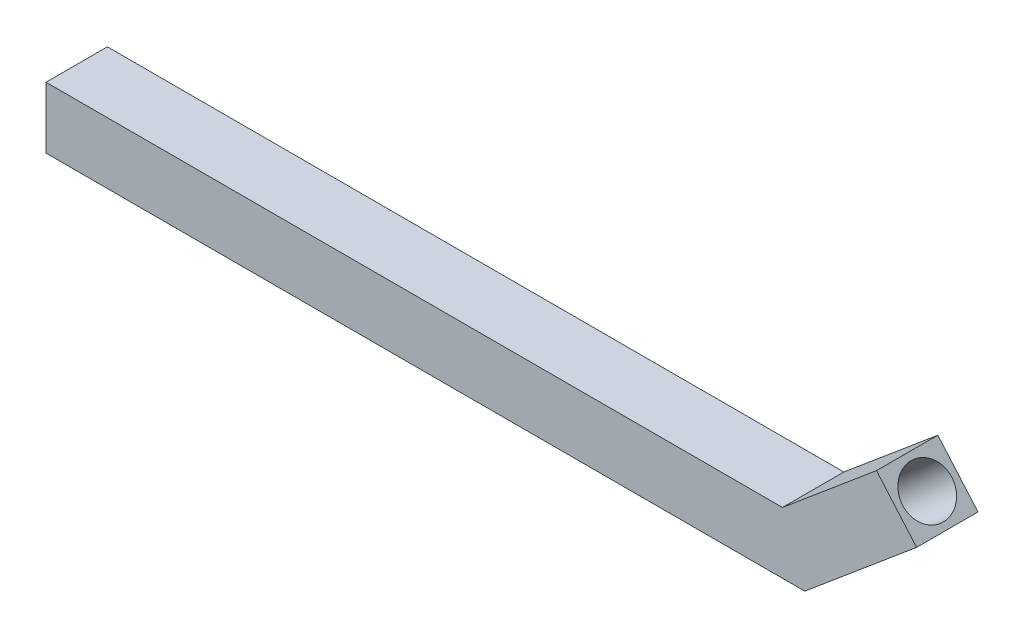
ISO-10303-21;
HEADER;
FILE_DESCRIPTION(('STEP AP214'),'2;1');
FILE_NAME('part.step','',(''),(''),'','','');
FILE_SCHEMA(('AUTOMOTIVE_DESIGN { 1 0 10303 214 1 1 1 1 }'));
ENDSEC;
DATA;
#1=APPLICATION_CONTEXT('core data for automotive mechanical design processes');
#2=APPLICATION_PROTOCOL_DEFINITION('international standard','automotive_design',2000,#1);
#3=PRODUCT_CONTEXT('',#1,'mechanical');
#4=PRODUCT('Part','Part','',(#3));
#5=PRODUCT_RELATED_PRODUCT_CATEGORY('part','',(#4));
#6=PRODUCT_DEFINITION_FORMATION('','',#4);
#7=PRODUCT_DEFINITION_CONTEXT('part definition',#1,'design');
#8=PRODUCT_DEFINITION('design','',#6,#7);
#9=PRODUCT_DEFINITION_SHAPE('','',#8);
#10=(LENGTH_UNIT() NAMED_UNIT(*) SI_UNIT(.MILLI.,.METRE.));
#11=(NAMED_UNIT(*) PLANE_ANGLE_UNIT() SI_UNIT($,.RADIAN.));
#12=(NAMED_UNIT(*) SI_UNIT($,.STERADIAN.) SOLID_ANGLE_UNIT());
#13=UNCERTAINTY_MEASURE_WITH_UNIT(LENGTH_MEASURE(1.E-05),#10,'distance_accuracy_value','');
#14=(GEOMETRIC_REPRESENTATION_CONTEXT(3) GLOBAL_UNCERTAINTY_ASSIGNED_CONTEXT((#13)) GLOBAL_UNIT_ASSIGNED_CONTEXT((#10,
#11,#12)) REPRESENTATION_CONTEXT('',''));
#15=CARTESIAN_POINT('',(0.,0.,0.));
#16=DIRECTION('',(0.,0.,1.));
#17=DIRECTION('',(1.,0.,0.));
#18=AXIS2_PLACEMENT_3D('',#15,#16,#17);
#19=CARTESIAN_POINT('',(-5.,-2.5,2.5));
#20=DIRECTION('',(0.,1.,0.));
#21=DIRECTION('',(0.,0.,1.));
#22=AXIS2_PLACEMENT_3D('',#19,#20,#21);
#23=PLANE('',#22);
#24=DIRECTION('',(1.,0.,0.));
#25=VECTOR('',#24,1.);
#26=CARTESIAN_POINT('',(-5.,-2.5,0.));
#27=LINE('',#26,#25);
#28=CARTESIAN_POINT('',(-30.,-2.5,0.));
#29=VERTEX_POINT('',#28);
#30=CARTESIAN_POINT('',(0.909480398793596,-2.5,0.));
#31=VERTEX_POINT('',#30);
#32=EDGE_CURVE('E127',#29,#31,#27,.T.);
#33=ORIENTED_EDGE('',*,*,#32,.T.);
#34=DIRECTION('',(0.,0.,-1.));
#35=VECTOR('',#34,1.);
#36=CARTESIAN_POINT('',(0.909480398793596,-2.5,2.5));
#37=LINE('',#36,#35);
#38=CARTESIAN_POINT('',(0.909480398793596,-2.5,2.5));
#39=VERTEX_POINT('',#38);
#40=EDGE_CURVE('E11',#39,#31,#37,.T.);
#41=ORIENTED_EDGE('',*,*,#40,.F.);
#42=DIRECTION('',(1.,0.,0.));
#43=VECTOR('',#42,1.);
#44=CARTESIAN_POINT('',(-5.,-2.5,2.5));
#45=LINE('',#44,#43);
#46=CARTESIAN_POINT('',(-30.,-2.5,2.5));
#47=VERTEX_POINT('',#46);
#48=EDGE_CURVE('E80',#47,#39,#45,.T.);
#49=ORIENTED_EDGE('',*,*,#48,.F.);
#50=DIRECTION('',(0.,0.,1.));
#51=VECTOR('',#50,1.);
#52=CARTESIAN_POINT('',(-30.,-2.5,0.));
#53=LINE('',#52,#51);
#54=EDGE_CURVE('E113',#29,#47,#53,.T.);
#55=ORIENTED_EDGE('',*,*,#54,.F.);
#56=EDGE_LOOP('',(#33,#41,#49,#55));
#57=FACE_BOUND('',#56,.T.);
#58=ADVANCED_FACE('F33',(#57),#23,.F.);
#59=CARTESIAN_POINT('',(0.909480398793596,-2.5,2.5));
#60=DIRECTION('',(-0.64278760968654,0.766044443118977,0.));
#61=DIRECTION('',(-0.766044443118977,-0.64278760968654,0.));
#62=AXIS2_PLACEMENT_3D('',#59,#60,#61);
#63=PLANE('',#62);
#64=DIRECTION('',(0.766044443118977,0.64278760968654,0.));
#65=VECTOR('',#64,1.);
#66=CARTESIAN_POINT('',(0.909480398793596,-2.5,0.));
#67=LINE('',#66,#65);
#68=CARTESIAN_POINT('',(5.46598283431779,1.32335951310674,0.));
#69=VERTEX_POINT('',#68);
#70=EDGE_CURVE('E137',#31,#69,#67,.T.);
#71=ORIENTED_EDGE('',*,*,#70,.T.);
#72=DIRECTION('',(0.,0.,-1.));
#73=VECTOR('',#72,1.);
#74=CARTESIAN_POINT('',(5.46598283431779,1.32335951310674,2.5));
#75=LINE('',#74,#73);
#76=CARTESIAN_POINT('',(5.46598283431779,1.32335951310674,2.5));
#77=VERTEX_POINT('',#76);
#78=EDGE_CURVE('E41',#77,#69,#75,.T.);
#79=ORIENTED_EDGE('',*,*,#78,.F.);
#80=DIRECTION('',(0.766044443118977,0.64278760968654,0.));
#81=VECTOR('',#80,1.);
#82=CARTESIAN_POINT('',(0.909480398793596,-2.5,2.5));
#83=LINE('',#82,#81);
#84=EDGE_CURVE('E131',#39,#77,#83,.T.);
#85=ORIENTED_EDGE('',*,*,#84,.F.);
#86=ORIENTED_EDGE('',*,*,#40,.T.);
#87=EDGE_LOOP('',(#71,#79,#85,#86));
#88=FACE_BOUND('',#87,.T.);
#89=ADVANCED_FACE('F153',(#88),#63,.F.);
#90=CARTESIAN_POINT('',(5.46598283431779,1.32335951310674,2.5));
#91=DIRECTION('',(-0.756231414130386,-0.65430424748916,0.));
#92=DIRECTION('',(0.65430424748916,-0.756231414130386,0.));
#93=AXIS2_PLACEMENT_3D('',#90,#91,#92);
#94=PLANE('',#93);
#95=CARTESIAN_POINT('',(4.64810252495634,2.26864878076972,1.25));
#96=DIRECTION('',(0.756231414130386,0.654304247489161,0.));
#97=DIRECTION('',(-0.654304247489161,0.756231414130386,0.));
#98=AXIS2_PLACEMENT_3D('',#95,#96,#97);
#99=CIRCLE('',#98,1.);
#100=CARTESIAN_POINT('',(3.99379827746718,3.02488019490011,1.25));
#101=VERTEX_POINT('',#100);
#102=EDGE_CURVE('E123',#101,#101,#99,.T.);
#103=ORIENTED_EDGE('',*,*,#102,.F.);
#104=EDGE_LOOP('',(#103));
#105=FACE_BOUND('',#104,.T.);
#106=DIRECTION('',(-0.65430424748916,0.756231414130386,0.));
#107=VECTOR('',#106,1.);
#108=CARTESIAN_POINT('',(5.46598283431779,1.32335951310674,0.));
#109=LINE('',#108,#107);
#110=CARTESIAN_POINT('',(3.83022221559489,3.2139380484327,0.));
#111=VERTEX_POINT('',#110);
#112=EDGE_CURVE('E67',#69,#111,#109,.T.);
#113=ORIENTED_EDGE('',*,*,#112,.T.);
#114=DIRECTION('',(0.,0.,-1.));
#115=VECTOR('',#114,1.);
#116=CARTESIAN_POINT('',(3.83022221559489,3.2139380484327,2.5));
#117=LINE('',#116,#115);
#118=CARTESIAN_POINT('',(3.83022221559489,3.2139380484327,2.5));
#119=VERTEX_POINT('',#118);
#120=EDGE_CURVE('E143',#119,#111,#117,.T.);
#121=ORIENTED_EDGE('',*,*,#120,.F.);
#122=DIRECTION('',(-0.65430424748916,0.756231414130386,0.));
#123=VECTOR('',#122,1.);
#124=CARTESIAN_POINT('',(5.46598283431779,1.32335951310674,2.5));
#125=LINE('',#124,#123);
#126=EDGE_CURVE('E133',#77,#119,#125,.T.);
#127=ORIENTED_EDGE('',*,*,#126,.F.);
#128=ORIENTED_EDGE('',*,*,#78,.T.);
#129=EDGE_LOOP('',(#113,#121,#127,#128));
#130=FACE_BOUND('',#129,.T.);
#131=ADVANCED_FACE('F146',(#105,#130),#94,.F.);
#132=CARTESIAN_POINT('',(0.,0.,2.5));
#133=DIRECTION('',(0.64278760968654,-0.766044443118977,0.));
#134=DIRECTION('',(0.766044443118977,0.64278760968654,0.));
#135=AXIS2_PLACEMENT_3D('',#132,#133,#134);
#136=PLANE('',#135);
#137=DIRECTION('',(-0.766044443118977,-0.64278760968654,0.));
#138=VECTOR('',#137,1.);
#139=CARTESIAN_POINT('',(0.,0.,0.));
#140=LINE('',#139,#138);
#141=CARTESIAN_POINT('',(0.,0.,0.));
#142=VERTEX_POINT('',#141);
#143=EDGE_CURVE('E73',#111,#142,#140,.T.);
#144=ORIENTED_EDGE('',*,*,#143,.T.);
#145=DIRECTION('',(0.,0.,-1.));
#146=VECTOR('',#145,1.);
#147=CARTESIAN_POINT('',(0.,0.,2.5));
#148=LINE('',#147,#146);
#149=CARTESIAN_POINT('',(0.,0.,2.5));
#150=VERTEX_POINT('',#149);
#151=EDGE_CURVE('E98',#150,#142,#148,.T.);
#152=ORIENTED_EDGE('',*,*,#151,.F.);
#153=DIRECTION('',(-0.766044443118977,-0.64278760968654,0.));
#154=VECTOR('',#153,1.);
#155=CARTESIAN_POINT('',(0.,0.,2.5));
#156=LINE('',#155,#154);
#157=EDGE_CURVE('E49',#119,#150,#156,.T.);
#158=ORIENTED_EDGE('',*,*,#157,.F.);
#159=ORIENTED_EDGE('',*,*,#120,.T.);
#160=EDGE_LOOP('',(#144,#152,#158,#159));
#161=FACE_BOUND('',#160,.T.);
#162=ADVANCED_FACE('F154',(#161),#136,.F.);
#163=CARTESIAN_POINT('',(-5.,0.,2.5));
#164=DIRECTION('',(0.,-1.,0.));
#165=DIRECTION('',(0.,0.,-1.));
#166=AXIS2_PLACEMENT_3D('',#163,#164,#165);
#167=PLANE('',#166);
#168=DIRECTION('',(-1.,0.,0.));
#169=VECTOR('',#168,1.);
#170=CARTESIAN_POINT('',(-5.,0.,0.));
#171=LINE('',#170,#169);
#172=CARTESIAN_POINT('',(-30.,0.,0.));
#173=VERTEX_POINT('',#172);
#174=EDGE_CURVE('E104',#142,#173,#171,.T.);
#175=ORIENTED_EDGE('',*,*,#174,.T.);
#176=DIRECTION('',(0.,0.,-1.));
#177=VECTOR('',#176,1.);
#178=CARTESIAN_POINT('',(-30.,0.,0.));
#179=LINE('',#178,#177);
#180=CARTESIAN_POINT('',(-30.,0.,2.5));
#181=VERTEX_POINT('',#180);
#182=EDGE_CURVE('E101',#181,#173,#179,.T.);
#183=ORIENTED_EDGE('',*,*,#182,.F.);
#184=DIRECTION('',(-1.,0.,0.));
#185=VECTOR('',#184,1.);
#186=CARTESIAN_POINT('',(-5.,0.,2.5));
#187=LINE('',#186,#185);
#188=EDGE_CURVE('E92',#150,#181,#187,.T.);
#189=ORIENTED_EDGE('',*,*,#188,.F.);
#190=ORIENTED_EDGE('',*,*,#151,.T.);
#191=EDGE_LOOP('',(#175,#183,#189,#190));
#192=FACE_BOUND('',#191,.T.);
#193=ADVANCED_FACE('F102',(#192),#167,.F.);
#194=CARTESIAN_POINT('',(0.,0.,2.5));
#195=DIRECTION('',(0.,0.,1.));
#196=DIRECTION('',(1.,0.,0.));
#197=AXIS2_PLACEMENT_3D('',#194,#195,#196);
#198=PLANE('',#197);
#199=ORIENTED_EDGE('',*,*,#188,.T.);
#200=DIRECTION('',(0.,1.,0.));
#201=VECTOR('',#200,1.);
#202=CARTESIAN_POINT('',(-30.,0.,2.5));
#203=LINE('',#202,#201);
#204=EDGE_CURVE('E96',#47,#181,#203,.T.);
#205=ORIENTED_EDGE('',*,*,#204,.F.);
#206=ORIENTED_EDGE('',*,*,#48,.T.);
#207=ORIENTED_EDGE('',*,*,#84,.T.);
#208=ORIENTED_EDGE('',*,*,#126,.T.);
#209=ORIENTED_EDGE('',*,*,#157,.T.);
#210=EDGE_LOOP('',(#199,#205,#206,#207,#208,#209));
#211=FACE_BOUND('',#210,.T.);
#212=ADVANCED_FACE('F94',(#211),#198,.T.);
#213=CARTESIAN_POINT('',(0.,0.,0.));
#214=DIRECTION('',(0.,0.,1.));
#215=DIRECTION('',(1.,0.,0.));
#216=AXIS2_PLACEMENT_3D('',#213,#214,#215);
#217=PLANE('',#216);
#218=ORIENTED_EDGE('',*,*,#32,.F.);
#219=DIRECTION('',(0.,-1.,0.));
#220=VECTOR('',#219,1.);
#221=CARTESIAN_POINT('',(-30.,0.,0.));
#222=LINE('',#221,#220);
#223=EDGE_CURVE('E108',#173,#29,#222,.T.);
#224=ORIENTED_EDGE('',*,*,#223,.F.);
#225=ORIENTED_EDGE('',*,*,#174,.F.);
#226=ORIENTED_EDGE('',*,*,#143,.F.);
#227=ORIENTED_EDGE('',*,*,#112,.F.);
#228=ORIENTED_EDGE('',*,*,#70,.F.);
#229=EDGE_LOOP('',(#218,#224,#225,#226,#227,#228));
#230=FACE_BOUND('',#229,.T.);
#231=ADVANCED_FACE('F151',(#230),#217,.F.);
#232=CARTESIAN_POINT('',(0.866945454304409,-1.00287245667608,1.25));
#233=DIRECTION('',(0.756231414130386,0.654304247489161,0.));
#234=DIRECTION('',(-0.654304247489161,0.756231414130386,0.));
#235=AXIS2_PLACEMENT_3D('',#232,#233,#234);
#236=CYLINDRICAL_SURFACE('',#235,1.);
#237=CARTESIAN_POINT('',(0.866945454304409,-1.00287245667608,1.25));
#238=DIRECTION('',(0.756231414130386,0.654304247489161,0.));
#239=DIRECTION('',(-0.654304247489161,0.756231414130386,0.));
#240=AXIS2_PLACEMENT_3D('',#237,#238,#239);
#241=CIRCLE('',#240,1.);
#242=CARTESIAN_POINT('',(0.212641206815248,-0.246641042545698,1.25));
#243=VERTEX_POINT('',#242);
#244=EDGE_CURVE('E124',#243,#243,#241,.T.);
#245=ORIENTED_EDGE('',*,*,#244,.F.);
#246=EDGE_LOOP('',(#245));
#247=FACE_BOUND('',#246,.T.);
#248=ORIENTED_EDGE('',*,*,#102,.T.);
#249=EDGE_LOOP('',(#248));
#250=FACE_BOUND('',#249,.T.);
#251=ADVANCED_FACE('F181',(#247,#250),#236,.F.);
#252=CARTESIAN_POINT('',(0.866945454304409,-1.00287245667608,1.25));
#253=DIRECTION('',(0.756231414130386,0.654304247489161,0.));
#254=DIRECTION('',(-0.654304247489161,0.756231414130386,0.));
#255=AXIS2_PLACEMENT_3D('',#252,#253,#254);
#256=PLANE('',#255);
#257=ORIENTED_EDGE('',*,*,#244,.T.);
#258=EDGE_LOOP('',(#257));
#259=FACE_BOUND('',#258,.T.);
#260=ADVANCED_FACE('F186',(#259),#256,.T.);
#261=CARTESIAN_POINT('',(-30.,0.,0.));
#262=DIRECTION('',(-1.,0.,0.));
#263=DIRECTION('',(0.,0.,1.));
#264=AXIS2_PLACEMENT_3D('',#261,#262,#263);
#265=PLANE('',#264);
#266=CARTESIAN_POINT('',(-30.,-1.25,1.25));
#267=DIRECTION('',(-1.,0.,0.));
#268=DIRECTION('',(0.,0.,1.));
#269=AXIS2_PLACEMENT_3D('',#266,#267,#268);
#270=CIRCLE('',#269,0.99999999999998);
#271=CARTESIAN_POINT('',(-30.,-1.25,2.24999999999998));
#272=VERTEX_POINT('',#271);
#273=EDGE_CURVE('E117',#272,#272,#270,.T.);
#274=ORIENTED_EDGE('',*,*,#273,.F.);
#275=EDGE_LOOP('',(#274));
#276=FACE_BOUND('',#275,.T.);
#277=ORIENTED_EDGE('',*,*,#204,.T.);
#278=ORIENTED_EDGE('',*,*,#182,.T.);
#279=ORIENTED_EDGE('',*,*,#223,.T.);
#280=ORIENTED_EDGE('',*,*,#54,.T.);
#281=EDGE_LOOP('',(#277,#278,#279,#280));
#282=FACE_BOUND('',#281,.T.);
#283=ADVANCED_FACE('F111',(#276,#282),#265,.T.);
#284=CARTESIAN_POINT('',(-25.,-1.25,1.25));
#285=DIRECTION('',(-1.,0.,0.));
#286=DIRECTION('',(0.,0.,1.));
#287=AXIS2_PLACEMENT_3D('',#284,#285,#286);
#288=CYLINDRICAL_SURFACE('',#287,0.99999999999998);
#289=CARTESIAN_POINT('',(-25.,-1.25,1.25));
#290=DIRECTION('',(-1.,0.,0.));
#291=DIRECTION('',(0.,0.,1.));
#292=AXIS2_PLACEMENT_3D('',#289,#290,#291);
#293=CIRCLE('',#292,0.99999999999998);
#294=CARTESIAN_POINT('',(-25.,-1.25,2.24999999999998));
#295=VERTEX_POINT('',#294);
#296=EDGE_CURVE('E114',#295,#295,#293,.T.);
#297=ORIENTED_EDGE('',*,*,#296,.F.);
#298=EDGE_LOOP('',(#297));
#299=FACE_BOUND('',#298,.T.);
#300=ORIENTED_EDGE('',*,*,#273,.T.);
#301=EDGE_LOOP('',(#300));
#302=FACE_BOUND('',#301,.T.);
#303=ADVANCED_FACE('F235',(#299,#302),#288,.F.);
#304=CARTESIAN_POINT('',(-25.,-1.25,1.25));
#305=DIRECTION('',(-1.,0.,0.));
#306=DIRECTION('',(0.,0.,1.));
#307=AXIS2_PLACEMENT_3D('',#304,#305,#306);
#308=PLANE('',#307);
#309=ORIENTED_EDGE('',*,*,#296,.T.);
#310=EDGE_LOOP('',(#309));
#311=FACE_BOUND('',#310,.T.);
#312=ADVANCED_FACE('F245',(#311),#308,.T.);
#313=CLOSED_SHELL('',(#58,#89,#131,#162,#193,#212,#231,#251,#260,#283,#303,#312));
#314=MANIFOLD_SOLID_BREP('B2',#313);
#315=ADVANCED_BREP_SHAPE_REPRESENTATION('',(#18,#314),#14);
#316=SHAPE_DEFINITION_REPRESENTATION(#9,#315);
ENDSEC;
END-ISO-10303-21;
